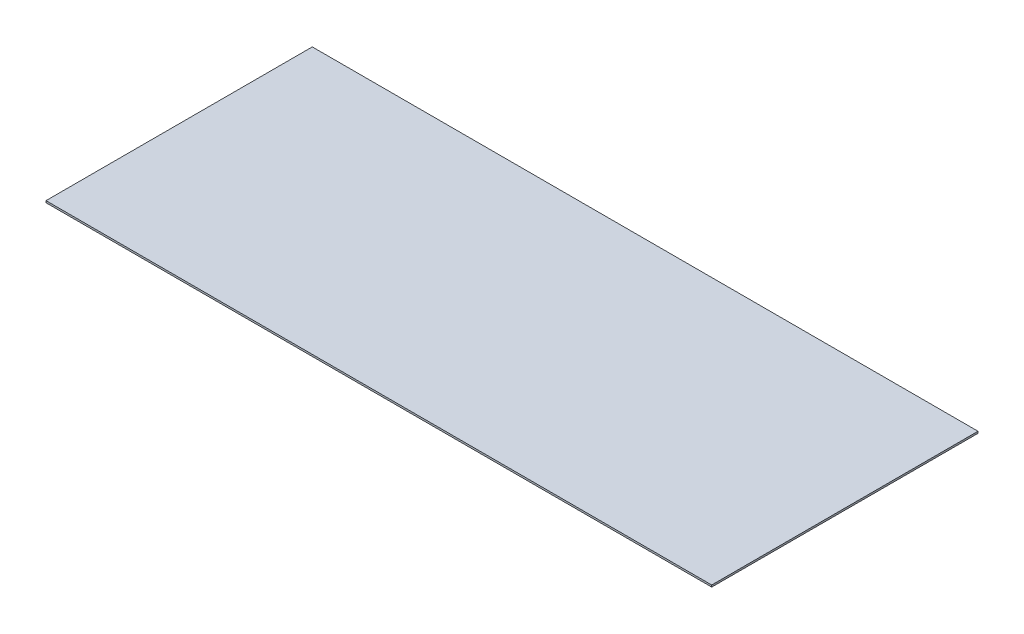
ISO-10303-21;
HEADER;
FILE_DESCRIPTION(('STEP AP214'),'2;1');
FILE_NAME('part.step','',(''),(''),'','','');
FILE_SCHEMA(('AUTOMOTIVE_DESIGN { 1 0 10303 214 1 1 1 1 }'));
ENDSEC;
DATA;
#1=APPLICATION_CONTEXT('core data for automotive mechanical design processes');
#2=APPLICATION_PROTOCOL_DEFINITION('international standard','automotive_design',2000,#1);
#3=PRODUCT_CONTEXT('',#1,'mechanical');
#4=PRODUCT('Part','Part','',(#3));
#5=PRODUCT_RELATED_PRODUCT_CATEGORY('part','',(#4));
#6=PRODUCT_DEFINITION_FORMATION('','',#4);
#7=PRODUCT_DEFINITION_CONTEXT('part definition',#1,'design');
#8=PRODUCT_DEFINITION('design','',#6,#7);
#9=PRODUCT_DEFINITION_SHAPE('','',#8);
#10=(LENGTH_UNIT() NAMED_UNIT(*) SI_UNIT(.MILLI.,.METRE.));
#11=(NAMED_UNIT(*) PLANE_ANGLE_UNIT() SI_UNIT($,.RADIAN.));
#12=(NAMED_UNIT(*) SI_UNIT($,.STERADIAN.) SOLID_ANGLE_UNIT());
#13=UNCERTAINTY_MEASURE_WITH_UNIT(LENGTH_MEASURE(1.E-05),#10,'distance_accuracy_value','');
#14=(GEOMETRIC_REPRESENTATION_CONTEXT(3) GLOBAL_UNCERTAINTY_ASSIGNED_CONTEXT((#13)) GLOBAL_UNIT_ASSIGNED_CONTEXT((#10,
#11,#12)) REPRESENTATION_CONTEXT('',''));
#15=CARTESIAN_POINT('',(0.,0.,0.));
#16=DIRECTION('',(0.,0.,1.));
#17=DIRECTION('',(1.,0.,0.));
#18=AXIS2_PLACEMENT_3D('',#15,#16,#17);
#19=CARTESIAN_POINT('',(0.,6.35,0.));
#20=DIRECTION('',(1.,0.,0.));
#21=DIRECTION('',(0.,0.,-1.));
#22=AXIS2_PLACEMENT_3D('',#19,#20,#21);
#23=PLANE('',#22);
#24=DIRECTION('',(0.,0.,1.));
#25=VECTOR('',#24,1.);
#26=CARTESIAN_POINT('',(0.,0.,0.));
#27=LINE('',#26,#25);
#28=CARTESIAN_POINT('',(0.,0.,-914.4));
#29=VERTEX_POINT('',#28);
#30=CARTESIAN_POINT('',(0.,0.,0.));
#31=VERTEX_POINT('',#30);
#32=EDGE_CURVE('E107',#29,#31,#27,.T.);
#33=ORIENTED_EDGE('',*,*,#32,.T.);
#34=DIRECTION('',(0.,-1.,0.));
#35=VECTOR('',#34,1.);
#36=CARTESIAN_POINT('',(0.,6.35,0.));
#37=LINE('',#36,#35);
#38=CARTESIAN_POINT('',(0.,6.35,0.));
#39=VERTEX_POINT('',#38);
#40=EDGE_CURVE('E11',#39,#31,#37,.T.);
#41=ORIENTED_EDGE('',*,*,#40,.F.);
#42=DIRECTION('',(0.,0.,1.));
#43=VECTOR('',#42,1.);
#44=CARTESIAN_POINT('',(0.,6.35,0.));
#45=LINE('',#44,#43);
#46=CARTESIAN_POINT('',(0.,6.35,-914.4));
#47=VERTEX_POINT('',#46);
#48=EDGE_CURVE('E91',#47,#39,#45,.T.);
#49=ORIENTED_EDGE('',*,*,#48,.F.);
#50=DIRECTION('',(0.,-1.,0.));
#51=VECTOR('',#50,1.);
#52=CARTESIAN_POINT('',(0.,6.35,-914.4));
#53=LINE('',#52,#51);
#54=EDGE_CURVE('E103',#47,#29,#53,.T.);
#55=ORIENTED_EDGE('',*,*,#54,.T.);
#56=EDGE_LOOP('',(#33,#41,#49,#55));
#57=FACE_BOUND('',#56,.T.);
#58=ADVANCED_FACE('F39',(#57),#23,.F.);
#59=CARTESIAN_POINT('',(0.,6.35,0.));
#60=DIRECTION('',(0.,0.,-1.));
#61=DIRECTION('',(-1.,0.,0.));
#62=AXIS2_PLACEMENT_3D('',#59,#60,#61);
#63=PLANE('',#62);
#64=DIRECTION('',(1.,0.,0.));
#65=VECTOR('',#64,1.);
#66=CARTESIAN_POINT('',(0.,0.,0.));
#67=LINE('',#66,#65);
#68=CARTESIAN_POINT('',(2286.,0.,0.));
#69=VERTEX_POINT('',#68);
#70=EDGE_CURVE('E96',#31,#69,#67,.T.);
#71=ORIENTED_EDGE('',*,*,#70,.T.);
#72=DIRECTION('',(0.,-1.,0.));
#73=VECTOR('',#72,1.);
#74=CARTESIAN_POINT('',(2286.,6.35,0.));
#75=LINE('',#74,#73);
#76=CARTESIAN_POINT('',(2286.,6.35,0.));
#77=VERTEX_POINT('',#76);
#78=EDGE_CURVE('E48',#77,#69,#75,.T.);
#79=ORIENTED_EDGE('',*,*,#78,.F.);
#80=DIRECTION('',(1.,0.,0.));
#81=VECTOR('',#80,1.);
#82=CARTESIAN_POINT('',(0.,6.35,0.));
#83=LINE('',#82,#81);
#84=EDGE_CURVE('E86',#39,#77,#83,.T.);
#85=ORIENTED_EDGE('',*,*,#84,.F.);
#86=ORIENTED_EDGE('',*,*,#40,.T.);
#87=EDGE_LOOP('',(#71,#79,#85,#86));
#88=FACE_BOUND('',#87,.T.);
#89=ADVANCED_FACE('F95',(#88),#63,.F.);
#90=CARTESIAN_POINT('',(2286.,6.35,0.));
#91=DIRECTION('',(-1.,0.,0.));
#92=DIRECTION('',(0.,0.,1.));
#93=AXIS2_PLACEMENT_3D('',#90,#91,#92);
#94=PLANE('',#93);
#95=DIRECTION('',(0.,0.,-1.));
#96=VECTOR('',#95,1.);
#97=CARTESIAN_POINT('',(2286.,0.,0.));
#98=LINE('',#97,#96);
#99=CARTESIAN_POINT('',(2286.,0.,-914.4));
#100=VERTEX_POINT('',#99);
#101=EDGE_CURVE('E73',#69,#100,#98,.T.);
#102=ORIENTED_EDGE('',*,*,#101,.T.);
#103=DIRECTION('',(0.,-1.,0.));
#104=VECTOR('',#103,1.);
#105=CARTESIAN_POINT('',(2286.,6.35,-914.4));
#106=LINE('',#105,#104);
#107=CARTESIAN_POINT('',(2286.,6.35,-914.4));
#108=VERTEX_POINT('',#107);
#109=EDGE_CURVE('E98',#108,#100,#106,.T.);
#110=ORIENTED_EDGE('',*,*,#109,.F.);
#111=DIRECTION('',(0.,0.,-1.));
#112=VECTOR('',#111,1.);
#113=CARTESIAN_POINT('',(2286.,6.35,0.));
#114=LINE('',#113,#112);
#115=EDGE_CURVE('E89',#77,#108,#114,.T.);
#116=ORIENTED_EDGE('',*,*,#115,.F.);
#117=ORIENTED_EDGE('',*,*,#78,.T.);
#118=EDGE_LOOP('',(#102,#110,#116,#117));
#119=FACE_BOUND('',#118,.T.);
#120=ADVANCED_FACE('F99',(#119),#94,.F.);
#121=CARTESIAN_POINT('',(0.,6.35,-914.4));
#122=DIRECTION('',(0.,0.,1.));
#123=DIRECTION('',(1.,0.,0.));
#124=AXIS2_PLACEMENT_3D('',#121,#122,#123);
#125=PLANE('',#124);
#126=DIRECTION('',(-1.,0.,0.));
#127=VECTOR('',#126,1.);
#128=CARTESIAN_POINT('',(0.,0.,-914.4));
#129=LINE('',#128,#127);
#130=EDGE_CURVE('E79',#100,#29,#129,.T.);
#131=ORIENTED_EDGE('',*,*,#130,.T.);
#132=ORIENTED_EDGE('',*,*,#54,.F.);
#133=DIRECTION('',(-1.,0.,0.));
#134=VECTOR('',#133,1.);
#135=CARTESIAN_POINT('',(0.,6.35,-914.4));
#136=LINE('',#135,#134);
#137=EDGE_CURVE('E56',#108,#47,#136,.T.);
#138=ORIENTED_EDGE('',*,*,#137,.F.);
#139=ORIENTED_EDGE('',*,*,#109,.T.);
#140=EDGE_LOOP('',(#131,#132,#138,#139));
#141=FACE_BOUND('',#140,.T.);
#142=ADVANCED_FACE('F120',(#141),#125,.F.);
#143=CARTESIAN_POINT('',(0.,6.35,0.));
#144=DIRECTION('',(0.,-1.,0.));
#145=DIRECTION('',(0.,0.,-1.));
#146=AXIS2_PLACEMENT_3D('',#143,#144,#145);
#147=PLANE('',#146);
#148=ORIENTED_EDGE('',*,*,#48,.T.);
#149=ORIENTED_EDGE('',*,*,#84,.T.);
#150=ORIENTED_EDGE('',*,*,#115,.T.);
#151=ORIENTED_EDGE('',*,*,#137,.T.);
#152=EDGE_LOOP('',(#148,#149,#150,#151));
#153=FACE_BOUND('',#152,.T.);
#154=ADVANCED_FACE('F87',(#153),#147,.F.);
#155=CARTESIAN_POINT('',(0.,0.,0.));
#156=DIRECTION('',(0.,-1.,0.));
#157=DIRECTION('',(0.,0.,-1.));
#158=AXIS2_PLACEMENT_3D('',#155,#156,#157);
#159=PLANE('',#158);
#160=ORIENTED_EDGE('',*,*,#32,.F.);
#161=ORIENTED_EDGE('',*,*,#130,.F.);
#162=ORIENTED_EDGE('',*,*,#101,.F.);
#163=ORIENTED_EDGE('',*,*,#70,.F.);
#164=EDGE_LOOP('',(#160,#161,#162,#163));
#165=FACE_BOUND('',#164,.T.);
#166=ADVANCED_FACE('F123',(#165),#159,.T.);
#167=CLOSED_SHELL('',(#58,#89,#120,#142,#154,#166));
#168=MANIFOLD_SOLID_BREP('B2',#167);
#169=ADVANCED_BREP_SHAPE_REPRESENTATION('',(#18,#168),#14);
#170=SHAPE_DEFINITION_REPRESENTATION(#9,#169);
ENDSEC;
END-ISO-10303-21;
